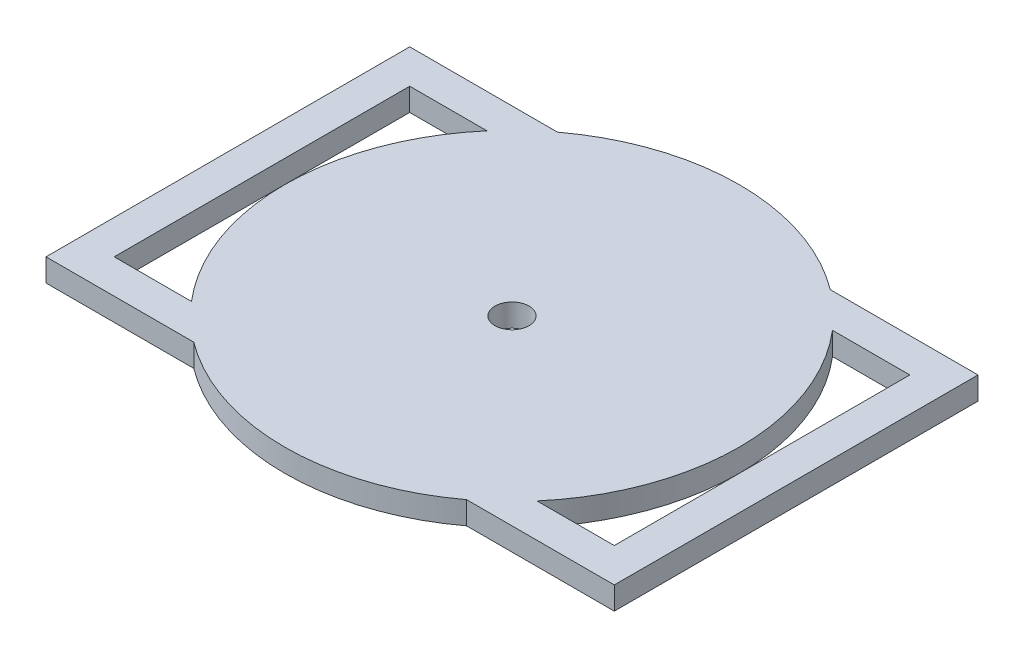
ISO-10303-21;
HEADER;
FILE_DESCRIPTION(('STEP AP214'),'2;1');
FILE_NAME('part.step','',(''),(''),'','','');
FILE_SCHEMA(('AUTOMOTIVE_DESIGN { 1 0 10303 214 1 1 1 1 }'));
ENDSEC;
DATA;
#1=APPLICATION_CONTEXT('core data for automotive mechanical design processes');
#2=APPLICATION_PROTOCOL_DEFINITION('international standard','automotive_design',2000,#1);
#3=PRODUCT_CONTEXT('',#1,'mechanical');
#4=PRODUCT('Part','Part','',(#3));
#5=PRODUCT_RELATED_PRODUCT_CATEGORY('part','',(#4));
#6=PRODUCT_DEFINITION_FORMATION('','',#4);
#7=PRODUCT_DEFINITION_CONTEXT('part definition',#1,'design');
#8=PRODUCT_DEFINITION('design','',#6,#7);
#9=PRODUCT_DEFINITION_SHAPE('','',#8);
#10=(LENGTH_UNIT() NAMED_UNIT(*) SI_UNIT(.MILLI.,.METRE.));
#11=(NAMED_UNIT(*) PLANE_ANGLE_UNIT() SI_UNIT($,.RADIAN.));
#12=(NAMED_UNIT(*) SI_UNIT($,.STERADIAN.) SOLID_ANGLE_UNIT());
#13=UNCERTAINTY_MEASURE_WITH_UNIT(LENGTH_MEASURE(1.E-05),#10,'distance_accuracy_value','');
#14=(GEOMETRIC_REPRESENTATION_CONTEXT(3) GLOBAL_UNCERTAINTY_ASSIGNED_CONTEXT((#13)) GLOBAL_UNIT_ASSIGNED_CONTEXT((#10,
#11,#12)) REPRESENTATION_CONTEXT('',''));
#15=CARTESIAN_POINT('',(0.,0.,0.));
#16=DIRECTION('',(0.,0.,1.));
#17=DIRECTION('',(1.,0.,0.));
#18=AXIS2_PLACEMENT_3D('',#15,#16,#17);
#19=CARTESIAN_POINT('',(0.,2.,0.));
#20=DIRECTION('',(0.,-1.,0.));
#21=DIRECTION('',(0.,0.,-1.));
#22=AXIS2_PLACEMENT_3D('',#19,#20,#21);
#23=CYLINDRICAL_SURFACE('',#22,20.);
#24=CARTESIAN_POINT('',(0.,0.,0.));
#25=DIRECTION('',(0.,1.,0.));
#26=DIRECTION('',(0.,0.,1.));
#27=AXIS2_PLACEMENT_3D('',#24,#25,#26);
#28=CIRCLE('',#27,20.);
#29=CARTESIAN_POINT('',(-12.,0.,16.));
#30=VERTEX_POINT('',#29);
#31=CARTESIAN_POINT('',(12.,0.,16.));
#32=VERTEX_POINT('',#31);
#33=EDGE_CURVE('E235',#30,#32,#28,.T.);
#34=ORIENTED_EDGE('',*,*,#33,.T.);
#35=DIRECTION('',(0.,-1.,0.));
#36=VECTOR('',#35,1.);
#37=CARTESIAN_POINT('',(12.,2.,16.));
#38=LINE('',#37,#36);
#39=CARTESIAN_POINT('',(12.,2.,16.));
#40=VERTEX_POINT('',#39);
#41=EDGE_CURVE('E11',#40,#32,#38,.T.);
#42=ORIENTED_EDGE('',*,*,#41,.F.);
#43=CARTESIAN_POINT('',(0.,2.,0.));
#44=DIRECTION('',(0.,1.,0.));
#45=DIRECTION('',(0.,0.,1.));
#46=AXIS2_PLACEMENT_3D('',#43,#44,#45);
#47=CIRCLE('',#46,20.);
#48=CARTESIAN_POINT('',(-12.,2.,16.));
#49=VERTEX_POINT('',#48);
#50=EDGE_CURVE('E340',#49,#40,#47,.T.);
#51=ORIENTED_EDGE('',*,*,#50,.F.);
#52=DIRECTION('',(0.,-1.,0.));
#53=VECTOR('',#52,1.);
#54=CARTESIAN_POINT('',(-12.,2.,16.));
#55=LINE('',#54,#53);
#56=EDGE_CURVE('E67',#49,#30,#55,.T.);
#57=ORIENTED_EDGE('',*,*,#56,.T.);
#58=EDGE_LOOP('',(#34,#42,#51,#57));
#59=FACE_BOUND('',#58,.T.);
#60=ADVANCED_FACE('F47',(#59),#23,.T.);
#61=CARTESIAN_POINT('',(0.,2.,16.));
#62=DIRECTION('',(0.,0.,-1.));
#63=DIRECTION('',(-1.,0.,0.));
#64=AXIS2_PLACEMENT_3D('',#61,#62,#63);
#65=PLANE('',#64);
#66=DIRECTION('',(1.,0.,0.));
#67=VECTOR('',#66,1.);
#68=CARTESIAN_POINT('',(0.,0.,16.));
#69=LINE('',#68,#67);
#70=CARTESIAN_POINT('',(25.,0.,16.));
#71=VERTEX_POINT('',#70);
#72=EDGE_CURVE('E236',#32,#71,#69,.T.);
#73=ORIENTED_EDGE('',*,*,#72,.T.);
#74=DIRECTION('',(0.,-1.,0.));
#75=VECTOR('',#74,1.);
#76=CARTESIAN_POINT('',(25.,2.,16.));
#77=LINE('',#76,#75);
#78=CARTESIAN_POINT('',(25.,2.,16.));
#79=VERTEX_POINT('',#78);
#80=EDGE_CURVE('E58',#79,#71,#77,.T.);
#81=ORIENTED_EDGE('',*,*,#80,.F.);
#82=DIRECTION('',(1.,0.,0.));
#83=VECTOR('',#82,1.);
#84=CARTESIAN_POINT('',(0.,2.,16.));
#85=LINE('',#84,#83);
#86=EDGE_CURVE('E341',#40,#79,#85,.T.);
#87=ORIENTED_EDGE('',*,*,#86,.F.);
#88=ORIENTED_EDGE('',*,*,#41,.T.);
#89=EDGE_LOOP('',(#73,#81,#87,#88));
#90=FACE_BOUND('',#89,.T.);
#91=ADVANCED_FACE('F396',(#90),#65,.F.);
#92=CARTESIAN_POINT('',(25.,2.,0.));
#93=DIRECTION('',(1.,0.,0.));
#94=DIRECTION('',(0.,0.,-1.));
#95=AXIS2_PLACEMENT_3D('',#92,#93,#94);
#96=PLANE('',#95);
#97=DIRECTION('',(0.,0.,1.));
#98=VECTOR('',#97,1.);
#99=CARTESIAN_POINT('',(25.,0.,0.));
#100=LINE('',#99,#98);
#101=CARTESIAN_POINT('',(25.,0.,-16.));
#102=VERTEX_POINT('',#101);
#103=EDGE_CURVE('E240',#102,#71,#100,.T.);
#104=ORIENTED_EDGE('',*,*,#103,.F.);
#105=DIRECTION('',(0.,-1.,0.));
#106=VECTOR('',#105,1.);
#107=CARTESIAN_POINT('',(25.,2.,-16.));
#108=LINE('',#107,#106);
#109=CARTESIAN_POINT('',(25.,2.,-16.));
#110=VERTEX_POINT('',#109);
#111=EDGE_CURVE('E268',#110,#102,#108,.T.);
#112=ORIENTED_EDGE('',*,*,#111,.F.);
#113=DIRECTION('',(0.,0.,1.));
#114=VECTOR('',#113,1.);
#115=CARTESIAN_POINT('',(25.,2.,0.));
#116=LINE('',#115,#114);
#117=EDGE_CURVE('E344',#110,#79,#116,.T.);
#118=ORIENTED_EDGE('',*,*,#117,.T.);
#119=ORIENTED_EDGE('',*,*,#80,.T.);
#120=EDGE_LOOP('',(#104,#112,#118,#119));
#121=FACE_BOUND('',#120,.T.);
#122=ADVANCED_FACE('F401',(#121),#96,.T.);
#123=CARTESIAN_POINT('',(0.,2.,-16.));
#124=DIRECTION('',(0.,0.,-1.));
#125=DIRECTION('',(-1.,0.,0.));
#126=AXIS2_PLACEMENT_3D('',#123,#124,#125);
#127=PLANE('',#126);
#128=DIRECTION('',(1.,0.,0.));
#129=VECTOR('',#128,1.);
#130=CARTESIAN_POINT('',(0.,0.,-16.));
#131=LINE('',#130,#129);
#132=CARTESIAN_POINT('',(12.,0.,-16.));
#133=VERTEX_POINT('',#132);
#134=EDGE_CURVE('E244',#133,#102,#131,.T.);
#135=ORIENTED_EDGE('',*,*,#134,.F.);
#136=DIRECTION('',(0.,-1.,0.));
#137=VECTOR('',#136,1.);
#138=CARTESIAN_POINT('',(12.,2.,-16.));
#139=LINE('',#138,#137);
#140=CARTESIAN_POINT('',(12.,2.,-16.));
#141=VERTEX_POINT('',#140);
#142=EDGE_CURVE('E265',#141,#133,#139,.T.);
#143=ORIENTED_EDGE('',*,*,#142,.F.);
#144=DIRECTION('',(1.,0.,0.));
#145=VECTOR('',#144,1.);
#146=CARTESIAN_POINT('',(0.,2.,-16.));
#147=LINE('',#146,#145);
#148=EDGE_CURVE('E347',#141,#110,#147,.T.);
#149=ORIENTED_EDGE('',*,*,#148,.T.);
#150=ORIENTED_EDGE('',*,*,#111,.T.);
#151=EDGE_LOOP('',(#135,#143,#149,#150));
#152=FACE_BOUND('',#151,.T.);
#153=ADVANCED_FACE('F407',(#152),#127,.T.);
#154=CARTESIAN_POINT('',(-12.,0.,-16.));
#155=VERTEX_POINT('',#154);
#156=EDGE_CURVE('E211',#133,#155,#28,.T.);
#157=ORIENTED_EDGE('',*,*,#156,.T.);
#158=DIRECTION('',(0.,-1.,0.));
#159=VECTOR('',#158,1.);
#160=CARTESIAN_POINT('',(-12.,2.,-16.));
#161=LINE('',#160,#159);
#162=CARTESIAN_POINT('',(-12.,2.,-16.));
#163=VERTEX_POINT('',#162);
#164=EDGE_CURVE('E192',#163,#155,#161,.T.);
#165=ORIENTED_EDGE('',*,*,#164,.F.);
#166=EDGE_CURVE('E178',#141,#163,#47,.T.);
#167=ORIENTED_EDGE('',*,*,#166,.F.);
#168=ORIENTED_EDGE('',*,*,#142,.T.);
#169=EDGE_LOOP('',(#157,#165,#167,#168));
#170=FACE_BOUND('',#169,.T.);
#171=ADVANCED_FACE('F381',(#170),#23,.T.);
#172=CARTESIAN_POINT('',(0.,2.,-16.));
#173=DIRECTION('',(0.,0.,1.));
#174=DIRECTION('',(1.,0.,0.));
#175=AXIS2_PLACEMENT_3D('',#172,#173,#174);
#176=PLANE('',#175);
#177=DIRECTION('',(-1.,0.,0.));
#178=VECTOR('',#177,1.);
#179=CARTESIAN_POINT('',(0.,0.,-16.));
#180=LINE('',#179,#178);
#181=CARTESIAN_POINT('',(-25.,0.,-16.));
#182=VERTEX_POINT('',#181);
#183=EDGE_CURVE('E188',#155,#182,#180,.T.);
#184=ORIENTED_EDGE('',*,*,#183,.T.);
#185=DIRECTION('',(0.,-1.,0.));
#186=VECTOR('',#185,1.);
#187=CARTESIAN_POINT('',(-25.,2.,-16.));
#188=LINE('',#187,#186);
#189=CARTESIAN_POINT('',(-25.,2.,-16.));
#190=VERTEX_POINT('',#189);
#191=EDGE_CURVE('E185',#190,#182,#188,.T.);
#192=ORIENTED_EDGE('',*,*,#191,.F.);
#193=DIRECTION('',(-1.,0.,0.));
#194=VECTOR('',#193,1.);
#195=CARTESIAN_POINT('',(0.,2.,-16.));
#196=LINE('',#195,#194);
#197=EDGE_CURVE('E169',#163,#190,#196,.T.);
#198=ORIENTED_EDGE('',*,*,#197,.F.);
#199=ORIENTED_EDGE('',*,*,#164,.T.);
#200=EDGE_LOOP('',(#184,#192,#198,#199));
#201=FACE_BOUND('',#200,.T.);
#202=ADVANCED_FACE('F186',(#201),#176,.F.);
#203=CARTESIAN_POINT('',(-25.,2.,0.));
#204=DIRECTION('',(1.,0.,0.));
#205=DIRECTION('',(0.,0.,-1.));
#206=AXIS2_PLACEMENT_3D('',#203,#204,#205);
#207=PLANE('',#206);
#208=DIRECTION('',(0.,0.,1.));
#209=VECTOR('',#208,1.);
#210=CARTESIAN_POINT('',(-25.,0.,0.));
#211=LINE('',#210,#209);
#212=CARTESIAN_POINT('',(-25.,0.,16.));
#213=VERTEX_POINT('',#212);
#214=EDGE_CURVE('E250',#182,#213,#211,.T.);
#215=ORIENTED_EDGE('',*,*,#214,.T.);
#216=DIRECTION('',(0.,-1.,0.));
#217=VECTOR('',#216,1.);
#218=CARTESIAN_POINT('',(-25.,2.,16.));
#219=LINE('',#218,#217);
#220=CARTESIAN_POINT('',(-25.,2.,16.));
#221=VERTEX_POINT('',#220);
#222=EDGE_CURVE('E118',#221,#213,#219,.T.);
#223=ORIENTED_EDGE('',*,*,#222,.F.);
#224=DIRECTION('',(0.,0.,1.));
#225=VECTOR('',#224,1.);
#226=CARTESIAN_POINT('',(-25.,2.,0.));
#227=LINE('',#226,#225);
#228=EDGE_CURVE('E175',#190,#221,#227,.T.);
#229=ORIENTED_EDGE('',*,*,#228,.F.);
#230=ORIENTED_EDGE('',*,*,#191,.T.);
#231=EDGE_LOOP('',(#215,#223,#229,#230));
#232=FACE_BOUND('',#231,.T.);
#233=ADVANCED_FACE('F194',(#232),#207,.F.);
#234=CARTESIAN_POINT('',(0.,2.,-13.));
#235=DIRECTION('',(0.,0.,1.));
#236=DIRECTION('',(1.,0.,0.));
#237=AXIS2_PLACEMENT_3D('',#234,#235,#236);
#238=PLANE('',#237);
#239=DIRECTION('',(-1.,0.,0.));
#240=VECTOR('',#239,1.);
#241=CARTESIAN_POINT('',(0.,0.,-13.));
#242=LINE('',#241,#240);
#243=CARTESIAN_POINT('',(-15.1986841535707,0.,-13.));
#244=VERTEX_POINT('',#243);
#245=CARTESIAN_POINT('',(-22.,0.,-13.));
#246=VERTEX_POINT('',#245);
#247=EDGE_CURVE('E219',#244,#246,#242,.T.);
#248=ORIENTED_EDGE('',*,*,#247,.F.);
#249=DIRECTION('',(0.,-1.,0.));
#250=VECTOR('',#249,1.);
#251=CARTESIAN_POINT('',(-15.1986841535707,2.,-13.));
#252=LINE('',#251,#250);
#253=CARTESIAN_POINT('',(-15.1986841535707,2.,-13.));
#254=VERTEX_POINT('',#253);
#255=EDGE_CURVE('E260',#254,#244,#252,.T.);
#256=ORIENTED_EDGE('',*,*,#255,.F.);
#257=DIRECTION('',(-1.,0.,0.));
#258=VECTOR('',#257,1.);
#259=CARTESIAN_POINT('',(0.,2.,-13.));
#260=LINE('',#259,#258);
#261=CARTESIAN_POINT('',(-22.,2.,-13.));
#262=VERTEX_POINT('',#261);
#263=EDGE_CURVE('E320',#254,#262,#260,.T.);
#264=ORIENTED_EDGE('',*,*,#263,.T.);
#265=DIRECTION('',(0.,-1.,0.));
#266=VECTOR('',#265,1.);
#267=CARTESIAN_POINT('',(-22.,2.,-13.));
#268=LINE('',#267,#266);
#269=EDGE_CURVE('E273',#262,#246,#268,.T.);
#270=ORIENTED_EDGE('',*,*,#269,.T.);
#271=EDGE_LOOP('',(#248,#256,#264,#270));
#272=FACE_BOUND('',#271,.T.);
#273=ADVANCED_FACE('F374',(#272),#238,.T.);
#274=CARTESIAN_POINT('',(-15.1986841535707,0.,13.));
#275=VERTEX_POINT('',#274);
#276=EDGE_CURVE('E212',#244,#275,#28,.T.);
#277=ORIENTED_EDGE('',*,*,#276,.T.);
#278=DIRECTION('',(0.,-1.,0.));
#279=VECTOR('',#278,1.);
#280=CARTESIAN_POINT('',(-15.1986841535707,2.,13.));
#281=LINE('',#280,#279);
#282=CARTESIAN_POINT('',(-15.1986841535707,2.,13.));
#283=VERTEX_POINT('',#282);
#284=EDGE_CURVE('E279',#283,#275,#281,.T.);
#285=ORIENTED_EDGE('',*,*,#284,.F.);
#286=EDGE_CURVE('E323',#254,#283,#47,.T.);
#287=ORIENTED_EDGE('',*,*,#286,.F.);
#288=ORIENTED_EDGE('',*,*,#255,.T.);
#289=EDGE_LOOP('',(#277,#285,#287,#288));
#290=FACE_BOUND('',#289,.T.);
#291=ADVANCED_FACE('F365',(#290),#23,.T.);
#292=CARTESIAN_POINT('',(0.,2.,13.));
#293=DIRECTION('',(0.,0.,1.));
#294=DIRECTION('',(1.,0.,0.));
#295=AXIS2_PLACEMENT_3D('',#292,#293,#294);
#296=PLANE('',#295);
#297=DIRECTION('',(-1.,0.,0.));
#298=VECTOR('',#297,1.);
#299=CARTESIAN_POINT('',(0.,0.,13.));
#300=LINE('',#299,#298);
#301=CARTESIAN_POINT('',(-22.,0.,13.));
#302=VERTEX_POINT('',#301);
#303=EDGE_CURVE('E223',#275,#302,#300,.T.);
#304=ORIENTED_EDGE('',*,*,#303,.T.);
#305=DIRECTION('',(0.,-1.,0.));
#306=VECTOR('',#305,1.);
#307=CARTESIAN_POINT('',(-22.,2.,13.));
#308=LINE('',#307,#306);
#309=CARTESIAN_POINT('',(-22.,2.,13.));
#310=VERTEX_POINT('',#309);
#311=EDGE_CURVE('E276',#310,#302,#308,.T.);
#312=ORIENTED_EDGE('',*,*,#311,.F.);
#313=DIRECTION('',(-1.,0.,0.));
#314=VECTOR('',#313,1.);
#315=CARTESIAN_POINT('',(0.,2.,13.));
#316=LINE('',#315,#314);
#317=EDGE_CURVE('E329',#283,#310,#316,.T.);
#318=ORIENTED_EDGE('',*,*,#317,.F.);
#319=ORIENTED_EDGE('',*,*,#284,.T.);
#320=EDGE_LOOP('',(#304,#312,#318,#319));
#321=FACE_BOUND('',#320,.T.);
#322=ADVANCED_FACE('F368',(#321),#296,.F.);
#323=CARTESIAN_POINT('',(0.,2.,13.));
#324=DIRECTION('',(0.,0.,-1.));
#325=DIRECTION('',(-1.,0.,0.));
#326=AXIS2_PLACEMENT_3D('',#323,#324,#325);
#327=PLANE('',#326);
#328=DIRECTION('',(1.,0.,0.));
#329=VECTOR('',#328,1.);
#330=CARTESIAN_POINT('',(0.,0.,13.));
#331=LINE('',#330,#329);
#332=CARTESIAN_POINT('',(15.1986841535707,0.,13.));
#333=VERTEX_POINT('',#332);
#334=CARTESIAN_POINT('',(22.,0.,13.));
#335=VERTEX_POINT('',#334);
#336=EDGE_CURVE('E203',#333,#335,#331,.T.);
#337=ORIENTED_EDGE('',*,*,#336,.F.);
#338=DIRECTION('',(0.,-1.,0.));
#339=VECTOR('',#338,1.);
#340=CARTESIAN_POINT('',(15.1986841535707,2.,13.));
#341=LINE('',#340,#339);
#342=CARTESIAN_POINT('',(15.1986841535707,2.,13.));
#343=VERTEX_POINT('',#342);
#344=EDGE_CURVE('E51',#343,#333,#341,.T.);
#345=ORIENTED_EDGE('',*,*,#344,.F.);
#346=DIRECTION('',(1.,0.,0.));
#347=VECTOR('',#346,1.);
#348=CARTESIAN_POINT('',(0.,2.,13.));
#349=LINE('',#348,#347);
#350=CARTESIAN_POINT('',(22.,2.,13.));
#351=VERTEX_POINT('',#350);
#352=EDGE_CURVE('E257',#343,#351,#349,.T.);
#353=ORIENTED_EDGE('',*,*,#352,.T.);
#354=DIRECTION('',(0.,-1.,0.));
#355=VECTOR('',#354,1.);
#356=CARTESIAN_POINT('',(22.,2.,13.));
#357=LINE('',#356,#355);
#358=EDGE_CURVE('E199',#351,#335,#357,.T.);
#359=ORIENTED_EDGE('',*,*,#358,.T.);
#360=EDGE_LOOP('',(#337,#345,#353,#359));
#361=FACE_BOUND('',#360,.T.);
#362=ADVANCED_FACE('F49',(#361),#327,.T.);
#363=CARTESIAN_POINT('',(15.1986841535707,0.,-13.));
#364=VERTEX_POINT('',#363);
#365=EDGE_CURVE('E207',#333,#364,#28,.T.);
#366=ORIENTED_EDGE('',*,*,#365,.T.);
#367=DIRECTION('',(0.,-1.,0.));
#368=VECTOR('',#367,1.);
#369=CARTESIAN_POINT('',(15.1986841535707,2.,-13.));
#370=LINE('',#369,#368);
#371=CARTESIAN_POINT('',(15.1986841535707,2.,-13.));
#372=VERTEX_POINT('',#371);
#373=EDGE_CURVE('E290',#372,#364,#370,.T.);
#374=ORIENTED_EDGE('',*,*,#373,.F.);
#375=EDGE_CURVE('E301',#343,#372,#47,.T.);
#376=ORIENTED_EDGE('',*,*,#375,.F.);
#377=ORIENTED_EDGE('',*,*,#344,.T.);
#378=EDGE_LOOP('',(#366,#374,#376,#377));
#379=FACE_BOUND('',#378,.T.);
#380=ADVANCED_FACE('F300',(#379),#23,.T.);
#381=CARTESIAN_POINT('',(0.,2.,-13.));
#382=DIRECTION('',(0.,0.,-1.));
#383=DIRECTION('',(-1.,0.,0.));
#384=AXIS2_PLACEMENT_3D('',#381,#382,#383);
#385=PLANE('',#384);
#386=DIRECTION('',(1.,0.,0.));
#387=VECTOR('',#386,1.);
#388=CARTESIAN_POINT('',(0.,0.,-13.));
#389=LINE('',#388,#387);
#390=CARTESIAN_POINT('',(22.,0.,-13.));
#391=VERTEX_POINT('',#390);
#392=EDGE_CURVE('E210',#364,#391,#389,.T.);
#393=ORIENTED_EDGE('',*,*,#392,.T.);
#394=DIRECTION('',(0.,-1.,0.));
#395=VECTOR('',#394,1.);
#396=CARTESIAN_POINT('',(22.,2.,-13.));
#397=LINE('',#396,#395);
#398=CARTESIAN_POINT('',(22.,2.,-13.));
#399=VERTEX_POINT('',#398);
#400=EDGE_CURVE('E287',#399,#391,#397,.T.);
#401=ORIENTED_EDGE('',*,*,#400,.F.);
#402=DIRECTION('',(1.,0.,0.));
#403=VECTOR('',#402,1.);
#404=CARTESIAN_POINT('',(0.,2.,-13.));
#405=LINE('',#404,#403);
#406=EDGE_CURVE('E314',#372,#399,#405,.T.);
#407=ORIENTED_EDGE('',*,*,#406,.F.);
#408=ORIENTED_EDGE('',*,*,#373,.T.);
#409=EDGE_LOOP('',(#393,#401,#407,#408));
#410=FACE_BOUND('',#409,.T.);
#411=ADVANCED_FACE('F313',(#410),#385,.F.);
#412=CARTESIAN_POINT('',(0.,2.,0.));
#413=DIRECTION('',(0.,-1.,0.));
#414=DIRECTION('',(0.,0.,-1.));
#415=AXIS2_PLACEMENT_3D('',#412,#413,#414);
#416=CYLINDRICAL_SURFACE('',#415,1.5);
#417=CARTESIAN_POINT('',(0.,2.,0.));
#418=DIRECTION('',(0.,1.,0.));
#419=DIRECTION('',(0.,0.,1.));
#420=AXIS2_PLACEMENT_3D('',#417,#418,#419);
#421=CIRCLE('',#420,1.5);
#422=CARTESIAN_POINT('',(0.,2.,1.5));
#423=VERTEX_POINT('',#422);
#424=EDGE_CURVE('E336',#423,#423,#421,.T.);
#425=ORIENTED_EDGE('',*,*,#424,.T.);
#426=EDGE_LOOP('',(#425));
#427=FACE_BOUND('',#426,.T.);
#428=CARTESIAN_POINT('',(0.,0.,0.));
#429=DIRECTION('',(0.,1.,0.));
#430=DIRECTION('',(0.,0.,1.));
#431=AXIS2_PLACEMENT_3D('',#428,#429,#430);
#432=CIRCLE('',#431,1.5);
#433=CARTESIAN_POINT('',(0.,0.,1.5));
#434=VERTEX_POINT('',#433);
#435=EDGE_CURVE('E231',#434,#434,#432,.T.);
#436=ORIENTED_EDGE('',*,*,#435,.F.);
#437=EDGE_LOOP('',(#436));
#438=FACE_BOUND('',#437,.T.);
#439=ADVANCED_FACE('F420',(#427,#438),#416,.F.);
#440=CARTESIAN_POINT('',(-22.,2.,0.));
#441=DIRECTION('',(1.,0.,0.));
#442=DIRECTION('',(0.,0.,-1.));
#443=AXIS2_PLACEMENT_3D('',#440,#441,#442);
#444=PLANE('',#443);
#445=DIRECTION('',(0.,0.,1.));
#446=VECTOR('',#445,1.);
#447=CARTESIAN_POINT('',(-22.,0.,0.));
#448=LINE('',#447,#446);
#449=EDGE_CURVE('E227',#246,#302,#448,.T.);
#450=ORIENTED_EDGE('',*,*,#449,.F.);
#451=ORIENTED_EDGE('',*,*,#269,.F.);
#452=DIRECTION('',(0.,0.,1.));
#453=VECTOR('',#452,1.);
#454=CARTESIAN_POINT('',(-22.,2.,0.));
#455=LINE('',#454,#453);
#456=EDGE_CURVE('E332',#262,#310,#455,.T.);
#457=ORIENTED_EDGE('',*,*,#456,.T.);
#458=ORIENTED_EDGE('',*,*,#311,.T.);
#459=EDGE_LOOP('',(#450,#451,#457,#458));
#460=FACE_BOUND('',#459,.T.);
#461=ADVANCED_FACE('F371',(#460),#444,.T.);
#462=CARTESIAN_POINT('',(22.,2.,0.));
#463=DIRECTION('',(1.,0.,0.));
#464=DIRECTION('',(0.,0.,-1.));
#465=AXIS2_PLACEMENT_3D('',#462,#463,#464);
#466=PLANE('',#465);
#467=DIRECTION('',(0.,0.,1.));
#468=VECTOR('',#467,1.);
#469=CARTESIAN_POINT('',(22.,0.,0.));
#470=LINE('',#469,#468);
#471=EDGE_CURVE('E215',#391,#335,#470,.T.);
#472=ORIENTED_EDGE('',*,*,#471,.T.);
#473=ORIENTED_EDGE('',*,*,#358,.F.);
#474=DIRECTION('',(0.,0.,1.));
#475=VECTOR('',#474,1.);
#476=CARTESIAN_POINT('',(22.,2.,0.));
#477=LINE('',#476,#475);
#478=EDGE_CURVE('E312',#399,#351,#477,.T.);
#479=ORIENTED_EDGE('',*,*,#478,.F.);
#480=ORIENTED_EDGE('',*,*,#400,.T.);
#481=EDGE_LOOP('',(#472,#473,#479,#480));
#482=FACE_BOUND('',#481,.T.);
#483=ADVANCED_FACE('F310',(#482),#466,.F.);
#484=CARTESIAN_POINT('',(0.,2.,16.));
#485=DIRECTION('',(0.,0.,1.));
#486=DIRECTION('',(1.,0.,0.));
#487=AXIS2_PLACEMENT_3D('',#484,#485,#486);
#488=PLANE('',#487);
#489=DIRECTION('',(-1.,0.,0.));
#490=VECTOR('',#489,1.);
#491=CARTESIAN_POINT('',(0.,0.,16.));
#492=LINE('',#491,#490);
#493=EDGE_CURVE('E253',#30,#213,#492,.T.);
#494=ORIENTED_EDGE('',*,*,#493,.F.);
#495=ORIENTED_EDGE('',*,*,#56,.F.);
#496=DIRECTION('',(-1.,0.,0.));
#497=VECTOR('',#496,1.);
#498=CARTESIAN_POINT('',(0.,2.,16.));
#499=LINE('',#498,#497);
#500=EDGE_CURVE('E196',#49,#221,#499,.T.);
#501=ORIENTED_EDGE('',*,*,#500,.T.);
#502=ORIENTED_EDGE('',*,*,#222,.T.);
#503=EDGE_LOOP('',(#494,#495,#501,#502));
#504=FACE_BOUND('',#503,.T.);
#505=ADVANCED_FACE('F384',(#504),#488,.T.);
#506=CARTESIAN_POINT('',(0.,2.,0.));
#507=DIRECTION('',(0.,1.,0.));
#508=DIRECTION('',(0.,0.,1.));
#509=AXIS2_PLACEMENT_3D('',#506,#507,#508);
#510=PLANE('',#509);
#511=ORIENTED_EDGE('',*,*,#352,.F.);
#512=ORIENTED_EDGE('',*,*,#375,.T.);
#513=ORIENTED_EDGE('',*,*,#406,.T.);
#514=ORIENTED_EDGE('',*,*,#478,.T.);
#515=EDGE_LOOP('',(#511,#512,#513,#514));
#516=FACE_BOUND('',#515,.T.);
#517=ORIENTED_EDGE('',*,*,#263,.F.);
#518=ORIENTED_EDGE('',*,*,#286,.T.);
#519=ORIENTED_EDGE('',*,*,#317,.T.);
#520=ORIENTED_EDGE('',*,*,#456,.F.);
#521=EDGE_LOOP('',(#517,#518,#519,#520));
#522=FACE_BOUND('',#521,.T.);
#523=ORIENTED_EDGE('',*,*,#424,.F.);
#524=EDGE_LOOP('',(#523));
#525=FACE_BOUND('',#524,.T.);
#526=ORIENTED_EDGE('',*,*,#50,.T.);
#527=ORIENTED_EDGE('',*,*,#86,.T.);
#528=ORIENTED_EDGE('',*,*,#117,.F.);
#529=ORIENTED_EDGE('',*,*,#148,.F.);
#530=ORIENTED_EDGE('',*,*,#166,.T.);
#531=ORIENTED_EDGE('',*,*,#197,.T.);
#532=ORIENTED_EDGE('',*,*,#228,.T.);
#533=ORIENTED_EDGE('',*,*,#500,.F.);
#534=EDGE_LOOP('',(#526,#527,#528,#529,#530,#531,#532,#533));
#535=FACE_BOUND('',#534,.T.);
#536=ADVANCED_FACE('F172',(#516,#522,#525,#535),#510,.T.);
#537=CARTESIAN_POINT('',(0.,0.,0.));
#538=DIRECTION('',(0.,1.,0.));
#539=DIRECTION('',(0.,0.,1.));
#540=AXIS2_PLACEMENT_3D('',#537,#538,#539);
#541=PLANE('',#540);
#542=ORIENTED_EDGE('',*,*,#336,.T.);
#543=ORIENTED_EDGE('',*,*,#471,.F.);
#544=ORIENTED_EDGE('',*,*,#392,.F.);
#545=ORIENTED_EDGE('',*,*,#365,.F.);
#546=EDGE_LOOP('',(#542,#543,#544,#545));
#547=FACE_BOUND('',#546,.T.);
#548=ORIENTED_EDGE('',*,*,#247,.T.);
#549=ORIENTED_EDGE('',*,*,#449,.T.);
#550=ORIENTED_EDGE('',*,*,#303,.F.);
#551=ORIENTED_EDGE('',*,*,#276,.F.);
#552=EDGE_LOOP('',(#548,#549,#550,#551));
#553=FACE_BOUND('',#552,.T.);
#554=ORIENTED_EDGE('',*,*,#435,.T.);
#555=EDGE_LOOP('',(#554));
#556=FACE_BOUND('',#555,.T.);
#557=ORIENTED_EDGE('',*,*,#33,.F.);
#558=ORIENTED_EDGE('',*,*,#493,.T.);
#559=ORIENTED_EDGE('',*,*,#214,.F.);
#560=ORIENTED_EDGE('',*,*,#183,.F.);
#561=ORIENTED_EDGE('',*,*,#156,.F.);
#562=ORIENTED_EDGE('',*,*,#134,.T.);
#563=ORIENTED_EDGE('',*,*,#103,.T.);
#564=ORIENTED_EDGE('',*,*,#72,.F.);
#565=EDGE_LOOP('',(#557,#558,#559,#560,#561,#562,#563,#564));
#566=FACE_BOUND('',#565,.T.);
#567=ADVANCED_FACE('F304',(#547,#553,#556,#566),#541,.F.);
#568=CLOSED_SHELL('',(#60,#91,#122,#153,#171,#202,#233,#273,#291,#322,#362,#380,#411,#439,#461,
#483,#505,#536,#567));
#569=MANIFOLD_SOLID_BREP('B2',#568);
#570=ADVANCED_BREP_SHAPE_REPRESENTATION('',(#18,#569),#14);
#571=SHAPE_DEFINITION_REPRESENTATION(#9,#570);
ENDSEC;
END-ISO-10303-21;
